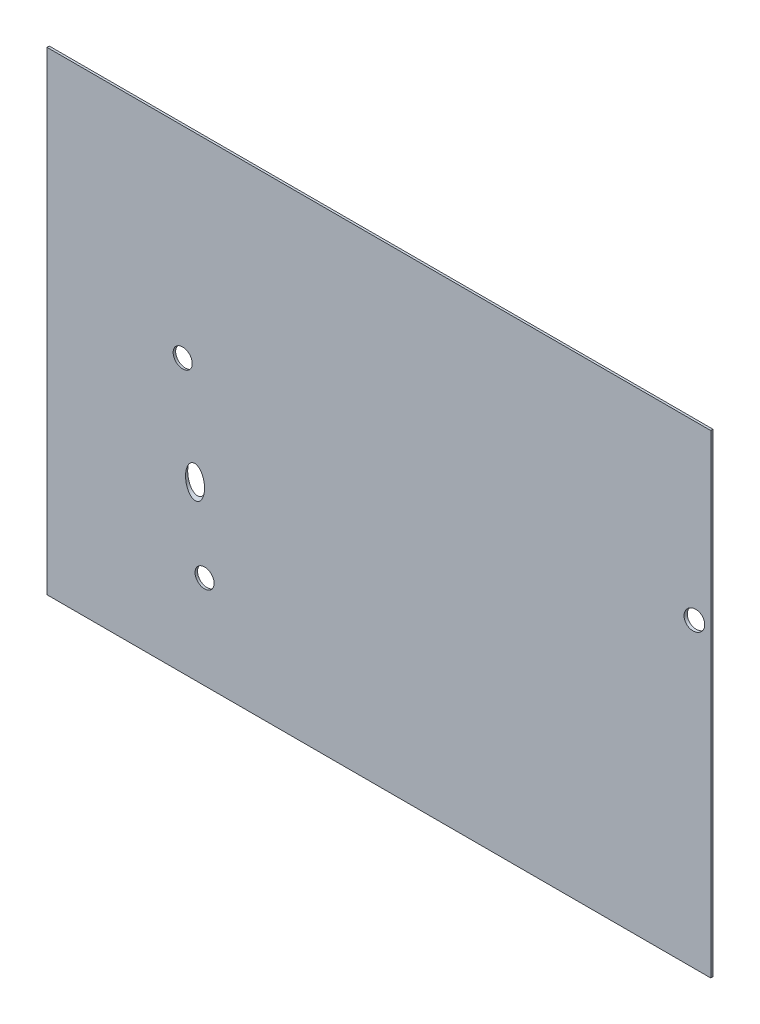
ISO-10303-21;
HEADER;
FILE_DESCRIPTION(('STEP AP214'),'2;1');
FILE_NAME('part.step','',(''),(''),'','','');
FILE_SCHEMA(('AUTOMOTIVE_DESIGN { 1 0 10303 214 1 1 1 1 }'));
ENDSEC;
DATA;
#1=APPLICATION_CONTEXT('core data for automotive mechanical design processes');
#2=APPLICATION_PROTOCOL_DEFINITION('international standard','automotive_design',2000,#1);
#3=PRODUCT_CONTEXT('',#1,'mechanical');
#4=PRODUCT('Part','Part','',(#3));
#5=PRODUCT_RELATED_PRODUCT_CATEGORY('part','',(#4));
#6=PRODUCT_DEFINITION_FORMATION('','',#4);
#7=PRODUCT_DEFINITION_CONTEXT('part definition',#1,'design');
#8=PRODUCT_DEFINITION('design','',#6,#7);
#9=PRODUCT_DEFINITION_SHAPE('','',#8);
#10=(LENGTH_UNIT() NAMED_UNIT(*) SI_UNIT(.MILLI.,.METRE.));
#11=(NAMED_UNIT(*) PLANE_ANGLE_UNIT() SI_UNIT($,.RADIAN.));
#12=(NAMED_UNIT(*) SI_UNIT($,.STERADIAN.) SOLID_ANGLE_UNIT());
#13=UNCERTAINTY_MEASURE_WITH_UNIT(LENGTH_MEASURE(1.E-05),#10,'distance_accuracy_value','');
#14=(GEOMETRIC_REPRESENTATION_CONTEXT(3) GLOBAL_UNCERTAINTY_ASSIGNED_CONTEXT((#13)) GLOBAL_UNIT_ASSIGNED_CONTEXT((#10,
#11,#12)) REPRESENTATION_CONTEXT('',''));
#15=CARTESIAN_POINT('',(0.,0.,0.));
#16=DIRECTION('',(0.,0.,1.));
#17=DIRECTION('',(1.,0.,0.));
#18=AXIS2_PLACEMENT_3D('',#15,#16,#17);
#19=CARTESIAN_POINT('',(444.5,-381.,3.));
#20=DIRECTION('',(0.,1.,0.));
#21=DIRECTION('',(0.,0.,1.));
#22=AXIS2_PLACEMENT_3D('',#19,#20,#21);
#23=PLANE('',#22);
#24=DIRECTION('',(1.,0.,0.));
#25=VECTOR('',#24,1.);
#26=CARTESIAN_POINT('',(444.5,-381.,0.));
#27=LINE('',#26,#25);
#28=CARTESIAN_POINT('',(-444.5,-381.,0.));
#29=VERTEX_POINT('',#28);
#30=CARTESIAN_POINT('',(444.5,-381.,0.));
#31=VERTEX_POINT('',#30);
#32=EDGE_CURVE('E109',#29,#31,#27,.T.);
#33=ORIENTED_EDGE('',*,*,#32,.T.);
#34=DIRECTION('',(0.,0.,-1.));
#35=VECTOR('',#34,1.);
#36=CARTESIAN_POINT('',(444.5,-381.,3.));
#37=LINE('',#36,#35);
#38=CARTESIAN_POINT('',(444.5,-381.,3.));
#39=VERTEX_POINT('',#38);
#40=EDGE_CURVE('E113',#39,#31,#37,.T.);
#41=ORIENTED_EDGE('',*,*,#40,.F.);
#42=DIRECTION('',(1.,0.,0.));
#43=VECTOR('',#42,1.);
#44=CARTESIAN_POINT('',(444.5,-381.,3.));
#45=LINE('',#44,#43);
#46=CARTESIAN_POINT('',(-444.5,-381.,3.));
#47=VERTEX_POINT('',#46);
#48=EDGE_CURVE('E95',#47,#39,#45,.T.);
#49=ORIENTED_EDGE('',*,*,#48,.F.);
#50=DIRECTION('',(0.,0.,-1.));
#51=VECTOR('',#50,1.);
#52=CARTESIAN_POINT('',(-444.5,-381.,3.));
#53=LINE('',#52,#51);
#54=EDGE_CURVE('E100',#47,#29,#53,.T.);
#55=ORIENTED_EDGE('',*,*,#54,.T.);
#56=EDGE_LOOP('',(#33,#41,#49,#55));
#57=FACE_BOUND('',#56,.T.);
#58=ADVANCED_FACE('F38',(#57),#23,.F.);
#59=CARTESIAN_POINT('',(444.5,254.,3.));
#60=DIRECTION('',(-1.,0.,0.));
#61=DIRECTION('',(0.,-1.,0.));
#62=AXIS2_PLACEMENT_3D('',#59,#60,#61);
#63=PLANE('',#62);
#64=DIRECTION('',(0.,1.,0.));
#65=VECTOR('',#64,1.);
#66=CARTESIAN_POINT('',(444.5,254.,0.));
#67=LINE('',#66,#65);
#68=CARTESIAN_POINT('',(444.5,254.,0.));
#69=VERTEX_POINT('',#68);
#70=EDGE_CURVE('E57',#31,#69,#67,.T.);
#71=ORIENTED_EDGE('',*,*,#70,.T.);
#72=DIRECTION('',(0.,0.,-1.));
#73=VECTOR('',#72,1.);
#74=CARTESIAN_POINT('',(444.5,254.,3.));
#75=LINE('',#74,#73);
#76=CARTESIAN_POINT('',(444.5,254.,3.));
#77=VERTEX_POINT('',#76);
#78=EDGE_CURVE('E115',#77,#69,#75,.T.);
#79=ORIENTED_EDGE('',*,*,#78,.F.);
#80=DIRECTION('',(0.,1.,0.));
#81=VECTOR('',#80,1.);
#82=CARTESIAN_POINT('',(444.5,254.,3.));
#83=LINE('',#82,#81);
#84=EDGE_CURVE('E80',#39,#77,#83,.T.);
#85=ORIENTED_EDGE('',*,*,#84,.F.);
#86=ORIENTED_EDGE('',*,*,#40,.T.);
#87=EDGE_LOOP('',(#71,#79,#85,#86));
#88=FACE_BOUND('',#87,.T.);
#89=ADVANCED_FACE('F139',(#88),#63,.F.);
#90=CARTESIAN_POINT('',(-444.5,254.,3.));
#91=DIRECTION('',(0.,-1.,0.));
#92=DIRECTION('',(0.,0.,-1.));
#93=AXIS2_PLACEMENT_3D('',#90,#91,#92);
#94=PLANE('',#93);
#95=DIRECTION('',(-1.,0.,0.));
#96=VECTOR('',#95,1.);
#97=CARTESIAN_POINT('',(-444.5,254.,0.));
#98=LINE('',#97,#96);
#99=CARTESIAN_POINT('',(-444.5,254.,0.));
#100=VERTEX_POINT('',#99);
#101=EDGE_CURVE('E71',#69,#100,#98,.T.);
#102=ORIENTED_EDGE('',*,*,#101,.T.);
#103=DIRECTION('',(0.,0.,-1.));
#104=VECTOR('',#103,1.);
#105=CARTESIAN_POINT('',(-444.5,254.,3.));
#106=LINE('',#105,#104);
#107=CARTESIAN_POINT('',(-444.5,254.,3.));
#108=VERTEX_POINT('',#107);
#109=EDGE_CURVE('E91',#108,#100,#106,.T.);
#110=ORIENTED_EDGE('',*,*,#109,.F.);
#111=DIRECTION('',(-1.,0.,0.));
#112=VECTOR('',#111,1.);
#113=CARTESIAN_POINT('',(-444.5,254.,3.));
#114=LINE('',#113,#112);
#115=EDGE_CURVE('E86',#77,#108,#114,.T.);
#116=ORIENTED_EDGE('',*,*,#115,.F.);
#117=ORIENTED_EDGE('',*,*,#78,.T.);
#118=EDGE_LOOP('',(#102,#110,#116,#117));
#119=FACE_BOUND('',#118,.T.);
#120=ADVANCED_FACE('F92',(#119),#94,.F.);
#121=CARTESIAN_POINT('',(-444.5,-381.,3.));
#122=DIRECTION('',(1.,0.,0.));
#123=DIRECTION('',(0.,1.,0.));
#124=AXIS2_PLACEMENT_3D('',#121,#122,#123);
#125=PLANE('',#124);
#126=DIRECTION('',(0.,-1.,0.));
#127=VECTOR('',#126,1.);
#128=CARTESIAN_POINT('',(-444.5,-381.,0.));
#129=LINE('',#128,#127);
#130=EDGE_CURVE('E96',#100,#29,#129,.T.);
#131=ORIENTED_EDGE('',*,*,#130,.T.);
#132=ORIENTED_EDGE('',*,*,#54,.F.);
#133=DIRECTION('',(0.,-1.,0.));
#134=VECTOR('',#133,1.);
#135=CARTESIAN_POINT('',(-444.5,-381.,3.));
#136=LINE('',#135,#134);
#137=EDGE_CURVE('E88',#108,#47,#136,.T.);
#138=ORIENTED_EDGE('',*,*,#137,.F.);
#139=ORIENTED_EDGE('',*,*,#109,.T.);
#140=EDGE_LOOP('',(#131,#132,#138,#139));
#141=FACE_BOUND('',#140,.T.);
#142=ADVANCED_FACE('F98',(#141),#125,.F.);
#143=CARTESIAN_POINT('',(0.,0.,3.));
#144=DIRECTION('',(0.,0.,-1.));
#145=DIRECTION('',(-1.,0.,0.));
#146=AXIS2_PLACEMENT_3D('',#143,#144,#145);
#147=PLANE('',#146);
#148=CARTESIAN_POINT('',(422.582050325051,23.1463226528901,3.));
#149=DIRECTION('',(0.,0.,-1.));
#150=DIRECTION('',(0.777464222864619,0.628927167616024,0.));
#151=AXIS2_PLACEMENT_3D('',#148,#149,#150);
#152=ELLIPSE('',#151,14.5144452720442,12.7);
#153=CARTESIAN_POINT('',(433.866512238792,32.2748516073546,3.));
#154=VERTEX_POINT('',#153);
#155=EDGE_CURVE('E11',#154,#154,#152,.F.);
#156=ORIENTED_EDGE('',*,*,#155,.F.);
#157=EDGE_LOOP('',(#156));
#158=FACE_BOUND('',#157,.T.);
#159=CARTESIAN_POINT('',(-262.752517618733,-15.4760036100241,3.));
#160=DIRECTION('',(0.,0.,-1.));
#161=DIRECTION('',(-0.886743415052822,0.462261955886983,0.));
#162=AXIS2_PLACEMENT_3D('',#159,#160,#161);
#163=ELLIPSE('',#162,12.8401173625095,12.7);
#164=CARTESIAN_POINT('',(-274.138407138444,-9.54050584421206,3.));
#165=VERTEX_POINT('',#164);
#166=EDGE_CURVE('E48',#165,#165,#163,.F.);
#167=ORIENTED_EDGE('',*,*,#166,.F.);
#168=EDGE_LOOP('',(#167));
#169=FACE_BOUND('',#168,.T.);
#170=CARTESIAN_POINT('',(-246.219017161242,-151.141791228245,3.));
#171=DIRECTION('',(0.,0.,-1.));
#172=DIRECTION('',(-0.0308953532954516,0.999522624628752,0.));
#173=AXIS2_PLACEMENT_3D('',#170,#171,#172);
#174=ELLIPSE('',#173,21.4439093034501,12.7);
#175=CARTESIAN_POINT('',(-246.881534315207,-129.70811871896,3.));
#176=VERTEX_POINT('',#175);
#177=EDGE_CURVE('E42',#176,#176,#174,.F.);
#178=ORIENTED_EDGE('',*,*,#177,.F.);
#179=EDGE_LOOP('',(#178));
#180=FACE_BOUND('',#179,.T.);
#181=CARTESIAN_POINT('',(-233.447400770647,-255.939405093655,3.));
#182=DIRECTION('',(0.,0.,-1.));
#183=DIRECTION('',(0.972201933384286,0.234143974348813,0.));
#184=AXIS2_PLACEMENT_3D('',#181,#182,#183);
#185=ELLIPSE('',#184,12.7966439976264,12.7);
#186=CARTESIAN_POINT('',(-221.006478735324,-252.943148009724,3.));
#187=VERTEX_POINT('',#186);
#188=EDGE_CURVE('E122',#187,#187,#185,.F.);
#189=ORIENTED_EDGE('',*,*,#188,.F.);
#190=EDGE_LOOP('',(#189));
#191=FACE_BOUND('',#190,.T.);
#192=ORIENTED_EDGE('',*,*,#48,.T.);
#193=ORIENTED_EDGE('',*,*,#84,.T.);
#194=ORIENTED_EDGE('',*,*,#115,.T.);
#195=ORIENTED_EDGE('',*,*,#137,.T.);
#196=EDGE_LOOP('',(#192,#193,#194,#195));
#197=FACE_BOUND('',#196,.T.);
#198=ADVANCED_FACE('F40',(#158,#169,#180,#191,#197),#147,.F.);
#199=CARTESIAN_POINT('',(0.,0.,0.));
#200=DIRECTION('',(0.,0.,-1.));
#201=DIRECTION('',(-1.,0.,0.));
#202=AXIS2_PLACEMENT_3D('',#199,#200,#201);
#203=PLANE('',#202);
#204=CARTESIAN_POINT('',(423.87258484712,24.1902963790187,0.));
#205=DIRECTION('',(0.,0.,-1.));
#206=DIRECTION('',(0.777464222864619,0.628927167616024,0.));
#207=AXIS2_PLACEMENT_3D('',#204,#205,#206);
#208=ELLIPSE('',#207,14.5144452720442,12.7);
#209=CARTESIAN_POINT('',(435.157046760861,33.3188253334832,0.));
#210=VERTEX_POINT('',#209);
#211=EDGE_CURVE('E102',#210,#210,#208,.F.);
#212=ORIENTED_EDGE('',*,*,#211,.T.);
#213=EDGE_LOOP('',(#212));
#214=FACE_BOUND('',#213,.T.);
#215=CARTESIAN_POINT('',(-262.356264286786,-15.6825716399001,0.));
#216=DIRECTION('',(0.,0.,-1.));
#217=DIRECTION('',(-0.886743415052822,0.462261955886983,0.));
#218=AXIS2_PLACEMENT_3D('',#215,#216,#217);
#219=ELLIPSE('',#218,12.8401173625095,12.7);
#220=CARTESIAN_POINT('',(-273.742153806496,-9.74707387408799,0.));
#221=VERTEX_POINT('',#220);
#222=EDGE_CURVE('E105',#221,#221,#219,.F.);
#223=ORIENTED_EDGE('',*,*,#222,.T.);
#224=EDGE_LOOP('',(#223));
#225=FACE_BOUND('',#224,.T.);
#226=CARTESIAN_POINT('',(-246.34511862964,-147.06217221701,0.));
#227=DIRECTION('',(0.,0.,-1.));
#228=DIRECTION('',(-0.0308953532954516,0.999522624628752,0.));
#229=AXIS2_PLACEMENT_3D('',#226,#227,#228);
#230=ELLIPSE('',#229,21.4439093034501,12.7);
#231=CARTESIAN_POINT('',(-247.007635783606,-125.628499707725,0.));
#232=VERTEX_POINT('',#231);
#233=EDGE_CURVE('E123',#232,#232,#230,.F.);
#234=ORIENTED_EDGE('',*,*,#233,.T.);
#235=EDGE_LOOP('',(#234));
#236=FACE_BOUND('',#235,.T.);
#237=CARTESIAN_POINT('',(-233.086902681364,-255.852583156287,0.));
#238=DIRECTION('',(0.,0.,-1.));
#239=DIRECTION('',(0.972201933384286,0.234143974348813,0.));
#240=AXIS2_PLACEMENT_3D('',#237,#238,#239);
#241=ELLIPSE('',#240,12.7966439976264,12.7);
#242=CARTESIAN_POINT('',(-220.645980646042,-252.856326072356,0.));
#243=VERTEX_POINT('',#242);
#244=EDGE_CURVE('E120',#243,#243,#241,.F.);
#245=ORIENTED_EDGE('',*,*,#244,.T.);
#246=EDGE_LOOP('',(#245));
#247=FACE_BOUND('',#246,.T.);
#248=ORIENTED_EDGE('',*,*,#32,.F.);
#249=ORIENTED_EDGE('',*,*,#130,.F.);
#250=ORIENTED_EDGE('',*,*,#101,.F.);
#251=ORIENTED_EDGE('',*,*,#70,.F.);
#252=EDGE_LOOP('',(#248,#249,#250,#251));
#253=FACE_BOUND('',#252,.T.);
#254=ADVANCED_FACE('F140',(#214,#225,#236,#247,#253),#203,.T.);
#255=CARTESIAN_POINT('',(-242.909273954016,-258.218191543119,81.7399999999999));
#256=DIRECTION('',(0.119258500763625,0.028722077569289,-0.992447707567364));
#257=DIRECTION('',(0.00169109488451186,-0.999585908637011,-0.028725449559799));
#258=AXIS2_PLACEMENT_3D('',#255,#256,#257);
#259=CYLINDRICAL_SURFACE('',#258,12.7);
#260=ORIENTED_EDGE('',*,*,#244,.F.);
#261=EDGE_LOOP('',(#260));
#262=FACE_BOUND('',#261,.T.);
#263=ORIENTED_EDGE('',*,*,#188,.T.);
#264=EDGE_LOOP('',(#263));
#265=FACE_BOUND('',#264,.T.);
#266=ADVANCED_FACE('F142',(#262,#265),#259,.F.);
#267=CARTESIAN_POINT('',(-242.909273954016,-258.218191543119,81.7399999999999));
#268=DIRECTION('',(-0.0248942271671806,0.805374939017381,-0.592242758551338));
#269=DIRECTION('',(0.0968189276126477,-0.587699070685327,-0.803265770197847));
#270=AXIS2_PLACEMENT_3D('',#267,#268,#269);
#271=CYLINDRICAL_SURFACE('',#270,12.7);
#272=ORIENTED_EDGE('',*,*,#233,.F.);
#273=EDGE_LOOP('',(#272));
#274=FACE_BOUND('',#273,.T.);
#275=ORIENTED_EDGE('',*,*,#177,.T.);
#276=EDGE_LOOP('',(#275));
#277=FACE_BOUND('',#276,.T.);
#278=ADVANCED_FACE('F149',(#274,#277),#271,.F.);
#279=CARTESIAN_POINT('',(-250.210363051184,-22.0142657532925,-91.9555768217709));
#280=DIRECTION('',(-0.130643076789685,0.0681046209926414,0.989087532570486));
#281=DIRECTION('',(0.0100156370190919,0.997677573505806,-0.0673731870900308));
#282=AXIS2_PLACEMENT_3D('',#279,#280,#281);
#283=CYLINDRICAL_SURFACE('',#282,12.7);
#284=ORIENTED_EDGE('',*,*,#222,.F.);
#285=EDGE_LOOP('',(#284));
#286=FACE_BOUND('',#285,.T.);
#287=ORIENTED_EDGE('',*,*,#166,.T.);
#288=EDGE_LOOP('',(#287));
#289=FACE_BOUND('',#288,.T.);
#290=ADVANCED_FACE('F165',(#286,#289),#283,.F.);
#291=CARTESIAN_POINT('',(388.709820902256,-4.25450774574343,81.7400000005108));
#292=DIRECTION('',(0.376401764428122,0.304488989493572,-0.874990381097175));
#293=DIRECTION('',(0.0365900455361288,-0.948597317973544,-0.314363319903998));
#294=AXIS2_PLACEMENT_3D('',#291,#292,#293);
#295=CYLINDRICAL_SURFACE('',#294,12.7);
#296=ORIENTED_EDGE('',*,*,#211,.F.);
#297=EDGE_LOOP('',(#296));
#298=FACE_BOUND('',#297,.T.);
#299=ORIENTED_EDGE('',*,*,#155,.T.);
#300=EDGE_LOOP('',(#299));
#301=FACE_BOUND('',#300,.T.);
#302=ADVANCED_FACE('F167',(#298,#301),#295,.F.);
#303=CLOSED_SHELL('',(#58,#89,#120,#142,#198,#254,#266,#278,#290,#302));
#304=MANIFOLD_SOLID_BREP('B2',#303);
#305=ADVANCED_BREP_SHAPE_REPRESENTATION('',(#18,#304),#14);
#306=SHAPE_DEFINITION_REPRESENTATION(#9,#305);
ENDSEC;
END-ISO-10303-21;
